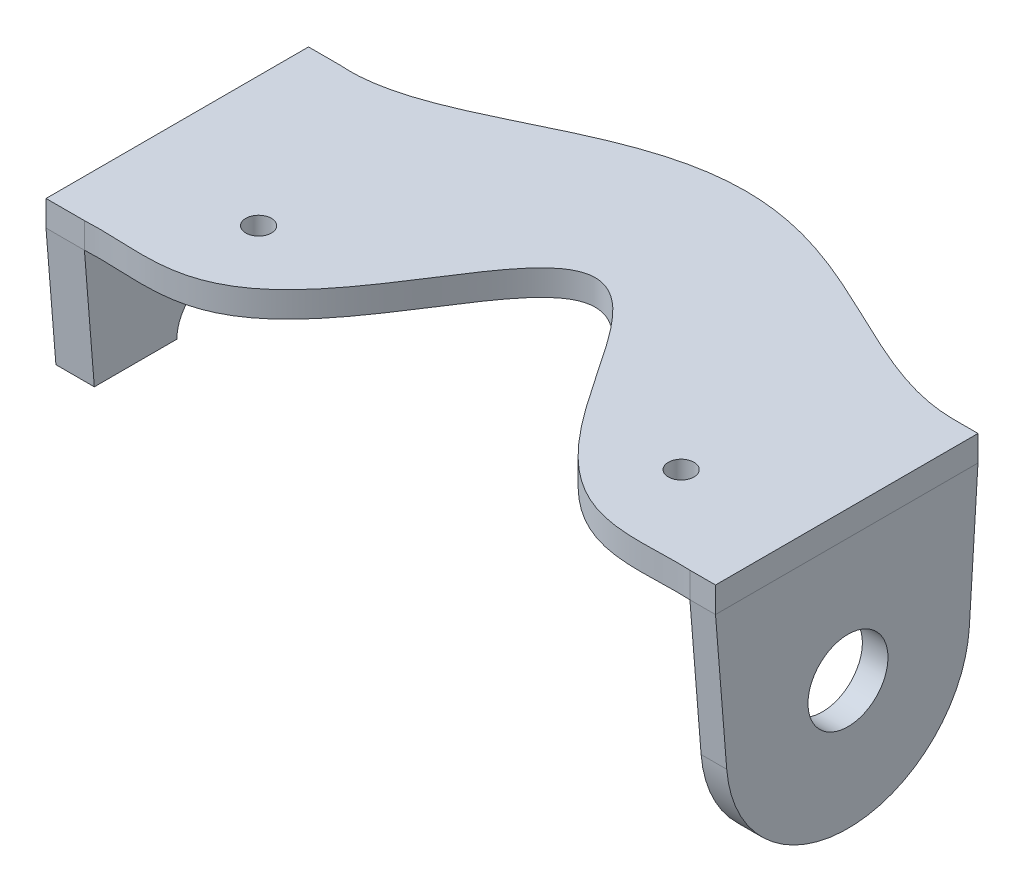
ISO-10303-21;
HEADER;
FILE_DESCRIPTION(('STEP AP214'),'2;1');
FILE_NAME('part.step','',(''),(''),'','','');
FILE_SCHEMA(('AUTOMOTIVE_DESIGN { 1 0 10303 214 1 1 1 1 }'));
ENDSEC;
DATA;
#1=APPLICATION_CONTEXT('core data for automotive mechanical design processes');
#2=APPLICATION_PROTOCOL_DEFINITION('international standard','automotive_design',2000,#1);
#3=PRODUCT_CONTEXT('',#1,'mechanical');
#4=PRODUCT('Part','Part','',(#3));
#5=PRODUCT_RELATED_PRODUCT_CATEGORY('part','',(#4));
#6=PRODUCT_DEFINITION_FORMATION('','',#4);
#7=PRODUCT_DEFINITION_CONTEXT('part definition',#1,'design');
#8=PRODUCT_DEFINITION('design','',#6,#7);
#9=PRODUCT_DEFINITION_SHAPE('','',#8);
#10=(LENGTH_UNIT() NAMED_UNIT(*) SI_UNIT(.MILLI.,.METRE.));
#11=(NAMED_UNIT(*) PLANE_ANGLE_UNIT() SI_UNIT($,.RADIAN.));
#12=(NAMED_UNIT(*) SI_UNIT($,.STERADIAN.) SOLID_ANGLE_UNIT());
#13=UNCERTAINTY_MEASURE_WITH_UNIT(LENGTH_MEASURE(1.E-05),#10,'distance_accuracy_value','');
#14=(GEOMETRIC_REPRESENTATION_CONTEXT(3) GLOBAL_UNCERTAINTY_ASSIGNED_CONTEXT((#13)) GLOBAL_UNIT_ASSIGNED_CONTEXT((#10,
#11,#12)) REPRESENTATION_CONTEXT('',''));
#15=CARTESIAN_POINT('',(0.,0.,0.));
#16=DIRECTION('',(0.,0.,1.));
#17=DIRECTION('',(1.,0.,0.));
#18=AXIS2_PLACEMENT_3D('',#15,#16,#17);
#19=CARTESIAN_POINT('',(0.0357860167297162,21.2689969603554,2.29301922996902));
#20=DIRECTION('',(0.,1.,0.));
#21=DIRECTION('',(0.,0.,-1.));
#22=AXIS2_PLACEMENT_3D('',#19,#20,#21);
#23=PLANE('',#22);
#24=CARTESIAN_POINT('',(-33.,21.2689969603556,21.5458460219843));
#25=DIRECTION('',(0.,1.,0.));
#26=DIRECTION('',(0.,0.,1.));
#27=AXIS2_PLACEMENT_3D('',#24,#25,#26);
#28=CIRCLE('',#27,2.00000000000001);
#29=CARTESIAN_POINT('',(-33.,21.2689969603556,23.5458460219843));
#30=VERTEX_POINT('',#29);
#31=EDGE_CURVE('P0_E188',#30,#30,#28,.T.);
#32=ORIENTED_EDGE('',*,*,#31,.T.);
#33=EDGE_LOOP('',(#32));
#34=FACE_BOUND('',#33,.T.);
#35=CARTESIAN_POINT('',(33.,21.2689969603555,21.5458460219843));
#36=DIRECTION('',(0.,1.,0.));
#37=DIRECTION('',(0.,0.,1.));
#38=AXIS2_PLACEMENT_3D('',#35,#36,#37);
#39=CIRCLE('',#38,2.);
#40=CARTESIAN_POINT('',(33.,21.2689969603556,23.5458460219843));
#41=VERTEX_POINT('',#40);
#42=EDGE_CURVE('P0_E233',#41,#41,#39,.T.);
#43=ORIENTED_EDGE('',*,*,#42,.T.);
#44=EDGE_LOOP('',(#43));
#45=FACE_BOUND('',#44,.T.);
#46=DIRECTION('',(0.,0.,1.));
#47=VECTOR('',#46,1.);
#48=CARTESIAN_POINT('',(-53.2837758577564,21.2689969603556,-6.53461129582813));
#49=LINE('',#48,#47);
#50=CARTESIAN_POINT('',(-53.2837758577564,21.2689969603556,-6.53461129582813));
#51=VERTEX_POINT('',#50);
#52=CARTESIAN_POINT('',(-53.2837758577564,21.2689969603556,34.4653887041719));
#53=VERTEX_POINT('',#52);
#54=EDGE_CURVE('P0_E182',#51,#53,#49,.T.);
#55=ORIENTED_EDGE('',*,*,#54,.F.);
#56=DIRECTION('',(-1.,0.,0.));
#57=VECTOR('',#56,1.);
#58=CARTESIAN_POINT('',(-48.2837758577565,21.2689969603556,-6.53461129582811));
#59=LINE('',#58,#57);
#60=CARTESIAN_POINT('',(-48.2837758577565,21.2689969603556,-6.53461129582813));
#61=VERTEX_POINT('',#60);
#62=EDGE_CURVE('P0_E58',#61,#51,#59,.T.);
#63=ORIENTED_EDGE('',*,*,#62,.F.);
#64=CARTESIAN_POINT('',(47.2888474952954,21.2689969603556,-6.53461129582813));
#65=CARTESIAN_POINT('',(22.2893497094017,21.2689969603556,-6.82632680724046));
#66=CARTESIAN_POINT('',(-0.735507918474241,21.2689969603556,-46.7031650132446));
#67=CARTESIAN_POINT('',(-23.0316048114772,21.2689969603556,-4.5792864379548));
#68=CARTESIAN_POINT('',(-48.2837758577565,21.2689969603556,-6.53461129582813));
#69=(BOUNDED_CURVE() B_SPLINE_CURVE(4,(#64,#65,#66,#67,#68),.UNSPECIFIED.,.F.,
.F.) B_SPLINE_CURVE_WITH_KNOTS((5,5),(0.,1.),
.UNSPECIFIED.) CURVE() GEOMETRIC_REPRESENTATION_ITEM() RATIONAL_B_SPLINE_CURVE((1.,1.,1.,1.,1.)) REPRESENTATION_ITEM(''));
#70=CARTESIAN_POINT('',(47.2888474952954,21.2689969603556,-6.53461129582813));
#71=VERTEX_POINT('',#70);
#72=EDGE_CURVE('P0_E103',#71,#61,#69,.T.);
#73=ORIENTED_EDGE('',*,*,#72,.F.);
#74=DIRECTION('',(-1.,0.,0.));
#75=VECTOR('',#74,1.);
#76=CARTESIAN_POINT('',(51.2888474952954,21.2689969603556,-6.53461129582813));
#77=LINE('',#76,#75);
#78=CARTESIAN_POINT('',(51.2888474952954,21.2689969603556,-6.53461129582813));
#79=VERTEX_POINT('',#78);
#80=EDGE_CURVE('P0_E197',#79,#71,#77,.T.);
#81=ORIENTED_EDGE('',*,*,#80,.F.);
#82=DIRECTION('',(0.,0.,-1.));
#83=VECTOR('',#82,1.);
#84=CARTESIAN_POINT('',(51.2888474952954,21.2689969603556,34.4653887041719));
#85=LINE('',#84,#83);
#86=CARTESIAN_POINT('',(51.2888474952954,21.2689969603556,34.4653887041719));
#87=VERTEX_POINT('',#86);
#88=EDGE_CURVE('P0_E143',#87,#79,#85,.T.);
#89=ORIENTED_EDGE('',*,*,#88,.F.);
#90=DIRECTION('',(1.,0.,0.));
#91=VECTOR('',#90,1.);
#92=CARTESIAN_POINT('',(47.2888474952954,21.2689969603556,34.4653887041719));
#93=LINE('',#92,#91);
#94=CARTESIAN_POINT('',(47.2888474952954,21.2689969603556,34.4653887041719));
#95=VERTEX_POINT('',#94);
#96=EDGE_CURVE('P0_E213',#95,#87,#93,.T.);
#97=ORIENTED_EDGE('',*,*,#96,.F.);
#98=CARTESIAN_POINT('',(-47.2837758577564,21.2689969603556,34.4653887041719));
#99=CARTESIAN_POINT('',(-35.7659756794948,21.2689969603556,33.7594323905051));
#100=CARTESIAN_POINT('',(-19.3052144255016,21.2689969603557,42.9273242584832));
#101=CARTESIAN_POINT('',(-0.477984318891941,21.2689969603551,-40.3925264297415));
#102=CARTESIAN_POINT('',(20.794089530906,21.2689969603557,41.4679138303698));
#103=CARTESIAN_POINT('',(35.8138139823402,21.2689969603556,33.926864755104));
#104=CARTESIAN_POINT('',(47.2888474952954,21.2689969603556,34.4653887041719));
#105=(BOUNDED_CURVE() B_SPLINE_CURVE(4,(#98,#99,#100,#101,#102,#103,#104),.UNSPECIFIED.,.F.,
.F.) B_SPLINE_CURVE_WITH_KNOTS((5,1,1,5),(0.,0.388004539781045,0.617610158258665,1.),
.UNSPECIFIED.) CURVE() GEOMETRIC_REPRESENTATION_ITEM() RATIONAL_B_SPLINE_CURVE((1.,1.,1.,1.,1.,
1.,1.)) REPRESENTATION_ITEM(''));
#106=CARTESIAN_POINT('',(-47.2837758577564,21.2689969603556,34.4653887041719));
#107=VERTEX_POINT('',#106);
#108=EDGE_CURVE('P0_E171',#107,#95,#105,.T.);
#109=ORIENTED_EDGE('',*,*,#108,.F.);
#110=DIRECTION('',(1.,0.,0.));
#111=VECTOR('',#110,1.);
#112=CARTESIAN_POINT('',(-53.2837758577564,21.2689969603556,34.4653887041719));
#113=LINE('',#112,#111);
#114=EDGE_CURVE('P0_E196',#53,#107,#113,.T.);
#115=ORIENTED_EDGE('',*,*,#114,.F.);
#116=EDGE_LOOP('',(#55,#63,#73,#81,#89,#97,#109,#115));
#117=FACE_BOUND('',#116,.T.);
#118=ADVANCED_FACE('P0_F47',(#34,#45,#117),#23,.F.);
#119=CARTESIAN_POINT('',(0.0357860167297162,25.2689969603554,2.29301922996902));
#120=DIRECTION('',(0.,1.,0.));
#121=DIRECTION('',(0.,0.,-1.));
#122=AXIS2_PLACEMENT_3D('',#119,#120,#121);
#123=PLANE('',#122);
#124=CARTESIAN_POINT('',(-33.,25.2689969603556,21.5458460219843));
#125=DIRECTION('',(0.,1.,0.));
#126=DIRECTION('',(0.,0.,1.));
#127=AXIS2_PLACEMENT_3D('',#124,#125,#126);
#128=CIRCLE('',#127,2.00000000000001);
#129=CARTESIAN_POINT('',(-33.,25.2689969603556,23.5458460219843));
#130=VERTEX_POINT('',#129);
#131=EDGE_CURVE('P0_E52',#130,#130,#128,.T.);
#132=ORIENTED_EDGE('',*,*,#131,.F.);
#133=EDGE_LOOP('',(#132));
#134=FACE_BOUND('',#133,.T.);
#135=CARTESIAN_POINT('',(33.,25.2689969603555,21.5458460219843));
#136=DIRECTION('',(0.,1.,0.));
#137=DIRECTION('',(0.,0.,1.));
#138=AXIS2_PLACEMENT_3D('',#135,#136,#137);
#139=CIRCLE('',#138,2.);
#140=CARTESIAN_POINT('',(33.,25.2689969603556,23.5458460219843));
#141=VERTEX_POINT('',#140);
#142=EDGE_CURVE('P0_E231',#141,#141,#139,.T.);
#143=ORIENTED_EDGE('',*,*,#142,.F.);
#144=EDGE_LOOP('',(#143));
#145=FACE_BOUND('',#144,.T.);
#146=DIRECTION('',(0.,0.,1.));
#147=VECTOR('',#146,1.);
#148=CARTESIAN_POINT('',(-53.2837758577564,25.2689969603556,-6.53461129582813));
#149=LINE('',#148,#147);
#150=CARTESIAN_POINT('',(-53.2837758577564,25.2689969603556,-6.53461129582813));
#151=VERTEX_POINT('',#150);
#152=CARTESIAN_POINT('',(-53.2837758577564,25.2689969603556,34.4653887041719));
#153=VERTEX_POINT('',#152);
#154=EDGE_CURVE('P0_E174',#151,#153,#149,.T.);
#155=ORIENTED_EDGE('',*,*,#154,.T.);
#156=DIRECTION('',(1.,0.,0.));
#157=VECTOR('',#156,1.);
#158=CARTESIAN_POINT('',(-53.2837758577564,25.2689969603556,34.4653887041719));
#159=LINE('',#158,#157);
#160=CARTESIAN_POINT('',(-47.2837758577564,25.2689969603556,34.4653887041719));
#161=VERTEX_POINT('',#160);
#162=EDGE_CURVE('P0_E160',#153,#161,#159,.T.);
#163=ORIENTED_EDGE('',*,*,#162,.T.);
#164=CARTESIAN_POINT('',(-47.2837758577564,25.2689969603556,34.4653887041719));
#165=CARTESIAN_POINT('',(-35.7659756794948,25.2689969603556,33.7594323905051));
#166=CARTESIAN_POINT('',(-19.3052144255016,25.2689969603557,42.9273242584832));
#167=CARTESIAN_POINT('',(-0.477984318891941,25.2689969603551,-40.3925264297415));
#168=CARTESIAN_POINT('',(20.794089530906,25.2689969603557,41.4679138303698));
#169=CARTESIAN_POINT('',(35.8138139823402,25.2689969603556,33.926864755104));
#170=CARTESIAN_POINT('',(47.2888474952954,25.2689969603556,34.4653887041719));
#171=(BOUNDED_CURVE() B_SPLINE_CURVE(4,(#164,#165,#166,#167,#168,#169,#170),.UNSPECIFIED.,.F.,
.F.) B_SPLINE_CURVE_WITH_KNOTS((5,1,1,5),(0.,0.388004539781045,0.617610158258665,1.),
.UNSPECIFIED.) CURVE() GEOMETRIC_REPRESENTATION_ITEM() RATIONAL_B_SPLINE_CURVE((1.,1.,1.,1.,1.,
1.,1.)) REPRESENTATION_ITEM(''));
#172=CARTESIAN_POINT('',(47.2888474952954,25.2689969603556,34.4653887041719));
#173=VERTEX_POINT('',#172);
#174=EDGE_CURVE('P0_E220',#161,#173,#171,.T.);
#175=ORIENTED_EDGE('',*,*,#174,.T.);
#176=DIRECTION('',(1.,0.,0.));
#177=VECTOR('',#176,1.);
#178=CARTESIAN_POINT('',(47.2888474952954,25.2689969603556,34.4653887041719));
#179=LINE('',#178,#177);
#180=CARTESIAN_POINT('',(51.2888474952954,25.2689969603556,34.4653887041719));
#181=VERTEX_POINT('',#180);
#182=EDGE_CURVE('P0_E152',#173,#181,#179,.T.);
#183=ORIENTED_EDGE('',*,*,#182,.T.);
#184=DIRECTION('',(0.,0.,-1.));
#185=VECTOR('',#184,1.);
#186=CARTESIAN_POINT('',(51.2888474952954,25.2689969603556,34.4653887041719));
#187=LINE('',#186,#185);
#188=CARTESIAN_POINT('',(51.2888474952954,25.2689969603556,-6.53461129582813));
#189=VERTEX_POINT('',#188);
#190=EDGE_CURVE('P0_E137',#181,#189,#187,.T.);
#191=ORIENTED_EDGE('',*,*,#190,.T.);
#192=DIRECTION('',(-1.,0.,0.));
#193=VECTOR('',#192,1.);
#194=CARTESIAN_POINT('',(51.2888474952954,25.2689969603556,-6.53461129582813));
#195=LINE('',#194,#193);
#196=CARTESIAN_POINT('',(47.2888474952954,25.2689969603556,-6.53461129582813));
#197=VERTEX_POINT('',#196);
#198=EDGE_CURVE('P0_E116',#189,#197,#195,.T.);
#199=ORIENTED_EDGE('',*,*,#198,.T.);
#200=CARTESIAN_POINT('',(47.2888474952954,25.2689969603556,-6.53461129582813));
#201=CARTESIAN_POINT('',(22.2893497094017,25.2689969603556,-6.82632680724046));
#202=CARTESIAN_POINT('',(-0.735507918474241,25.2689969603556,-46.7031650132446));
#203=CARTESIAN_POINT('',(-23.0316048114772,25.2689969603556,-4.5792864379548));
#204=CARTESIAN_POINT('',(-48.2837758577565,25.2689969603556,-6.53461129582813));
#205=(BOUNDED_CURVE() B_SPLINE_CURVE(4,(#200,#201,#202,#203,#204),.UNSPECIFIED.,.F.,
.F.) B_SPLINE_CURVE_WITH_KNOTS((5,5),(0.,1.),
.UNSPECIFIED.) CURVE() GEOMETRIC_REPRESENTATION_ITEM() RATIONAL_B_SPLINE_CURVE((1.,1.,1.,1.,1.)) REPRESENTATION_ITEM(''));
#206=CARTESIAN_POINT('',(-48.2837758577565,25.2689969603556,-6.53461129582813));
#207=VERTEX_POINT('',#206);
#208=EDGE_CURVE('P0_E207',#197,#207,#205,.T.);
#209=ORIENTED_EDGE('',*,*,#208,.T.);
#210=DIRECTION('',(-1.,0.,0.));
#211=VECTOR('',#210,1.);
#212=CARTESIAN_POINT('',(-48.2837758577565,25.2689969603556,-6.53461129582811));
#213=LINE('',#212,#211);
#214=EDGE_CURVE('P0_E11',#207,#151,#213,.T.);
#215=ORIENTED_EDGE('',*,*,#214,.T.);
#216=EDGE_LOOP('',(#155,#163,#175,#183,#191,#199,#209,#215));
#217=FACE_BOUND('',#216,.T.);
#218=ADVANCED_FACE('P0_F175',(#134,#145,#217),#123,.T.);
#219=CARTESIAN_POINT('',(-48.2837758577565,25.2689969603556,-6.53461129582811));
#220=DIRECTION('',(0.,0.,1.));
#221=DIRECTION('',(1.,0.,0.));
#222=AXIS2_PLACEMENT_3D('',#219,#220,#221);
#223=PLANE('',#222);
#224=ORIENTED_EDGE('',*,*,#62,.T.);
#225=DIRECTION('',(0.,-1.,0.));
#226=VECTOR('',#225,1.);
#227=CARTESIAN_POINT('',(-53.2837758577564,25.2689969603556,-6.53461129582813));
#228=LINE('',#227,#226);
#229=EDGE_CURVE('P0_E179',#151,#51,#228,.T.);
#230=ORIENTED_EDGE('',*,*,#229,.F.);
#231=ORIENTED_EDGE('',*,*,#214,.F.);
#232=DIRECTION('',(0.,-1.,0.));
#233=VECTOR('',#232,1.);
#234=CARTESIAN_POINT('',(-48.2837758577565,25.2689969603556,-6.53461129582813));
#235=LINE('',#234,#233);
#236=EDGE_CURVE('P0_E212',#207,#61,#235,.T.);
#237=ORIENTED_EDGE('',*,*,#236,.T.);
#238=EDGE_LOOP('',(#224,#230,#231,#237));
#239=FACE_BOUND('',#238,.T.);
#240=ADVANCED_FACE('P0_F270',(#239),#223,.F.);
#241=CARTESIAN_POINT('',(47.2888474952954,25.2689969603556,-6.53461129582813));
#242=CARTESIAN_POINT('',(22.2893497094017,25.2689969603556,-6.82632680724046));
#243=CARTESIAN_POINT('',(-0.735507918474241,25.2689969603556,-46.7031650132446));
#244=CARTESIAN_POINT('',(-23.0316048114772,25.2689969603556,-4.5792864379548));
#245=CARTESIAN_POINT('',(-48.2837758577565,25.2689969603556,-6.53461129582813));
#246=(BOUNDED_CURVE() B_SPLINE_CURVE(4,(#241,#242,#243,#244,#245),.UNSPECIFIED.,.F.,
.F.) B_SPLINE_CURVE_WITH_KNOTS((5,5),(0.,1.),
.UNSPECIFIED.) CURVE() GEOMETRIC_REPRESENTATION_ITEM() RATIONAL_B_SPLINE_CURVE((1.,1.,1.,1.,1.)) REPRESENTATION_ITEM(''));
#247=DIRECTION('',(0.,-1.,0.));
#248=VECTOR('',#247,1.);
#249=SURFACE_OF_LINEAR_EXTRUSION('',#246,#248);
#250=ORIENTED_EDGE('',*,*,#72,.T.);
#251=ORIENTED_EDGE('',*,*,#236,.F.);
#252=ORIENTED_EDGE('',*,*,#208,.F.);
#253=DIRECTION('',(0.,-1.,0.));
#254=VECTOR('',#253,1.);
#255=CARTESIAN_POINT('',(47.2888474952954,25.2689969603556,-6.53461129582813));
#256=LINE('',#255,#254);
#257=EDGE_CURVE('P0_E201',#197,#71,#256,.T.);
#258=ORIENTED_EDGE('',*,*,#257,.T.);
#259=EDGE_LOOP('',(#250,#251,#252,#258));
#260=FACE_BOUND('',#259,.T.);
#261=ADVANCED_FACE('P0_F49',(#260),#249,.F.);
#262=CARTESIAN_POINT('',(51.2888474952954,25.2689969603556,-6.53461129582813));
#263=DIRECTION('',(0.,0.,1.));
#264=DIRECTION('',(1.,0.,0.));
#265=AXIS2_PLACEMENT_3D('',#262,#263,#264);
#266=PLANE('',#265);
#267=ORIENTED_EDGE('',*,*,#80,.T.);
#268=ORIENTED_EDGE('',*,*,#257,.F.);
#269=ORIENTED_EDGE('',*,*,#198,.F.);
#270=DIRECTION('',(0.,-1.,0.));
#271=VECTOR('',#270,1.);
#272=CARTESIAN_POINT('',(51.2888474952954,25.2689969603556,-6.53461129582813));
#273=LINE('',#272,#271);
#274=EDGE_CURVE('P0_E204',#189,#79,#273,.T.);
#275=ORIENTED_EDGE('',*,*,#274,.T.);
#276=EDGE_LOOP('',(#267,#268,#269,#275));
#277=FACE_BOUND('',#276,.T.);
#278=ADVANCED_FACE('P0_F266',(#277),#266,.F.);
#279=CARTESIAN_POINT('',(51.2888474952954,25.2689969603556,34.4653887041719));
#280=DIRECTION('',(-1.,0.,0.));
#281=DIRECTION('',(0.,0.,1.));
#282=AXIS2_PLACEMENT_3D('',#279,#280,#281);
#283=PLANE('',#282);
#284=ORIENTED_EDGE('',*,*,#88,.T.);
#285=ORIENTED_EDGE('',*,*,#274,.F.);
#286=ORIENTED_EDGE('',*,*,#190,.F.);
#287=DIRECTION('',(0.,-1.,0.));
#288=VECTOR('',#287,1.);
#289=CARTESIAN_POINT('',(51.2888474952954,25.2689969603556,34.4653887041719));
#290=LINE('',#289,#288);
#291=EDGE_CURVE('P0_E192',#181,#87,#290,.T.);
#292=ORIENTED_EDGE('',*,*,#291,.T.);
#293=EDGE_LOOP('',(#284,#285,#286,#292));
#294=FACE_BOUND('',#293,.T.);
#295=ADVANCED_FACE('P0_F263',(#294),#283,.F.);
#296=CARTESIAN_POINT('',(47.2888474952954,25.2689969603556,34.4653887041719));
#297=DIRECTION('',(0.,0.,-1.));
#298=DIRECTION('',(0.,-1.,0.));
#299=AXIS2_PLACEMENT_3D('',#296,#297,#298);
#300=PLANE('',#299);
#301=ORIENTED_EDGE('',*,*,#96,.T.);
#302=ORIENTED_EDGE('',*,*,#291,.F.);
#303=ORIENTED_EDGE('',*,*,#182,.F.);
#304=DIRECTION('',(0.,-1.,0.));
#305=VECTOR('',#304,1.);
#306=CARTESIAN_POINT('',(47.2888474952954,25.2689969603556,34.4653887041719));
#307=LINE('',#306,#305);
#308=EDGE_CURVE('P0_E290',#173,#95,#307,.T.);
#309=ORIENTED_EDGE('',*,*,#308,.T.);
#310=EDGE_LOOP('',(#301,#302,#303,#309));
#311=FACE_BOUND('',#310,.T.);
#312=ADVANCED_FACE('P0_F258',(#311),#300,.F.);
#313=CARTESIAN_POINT('',(-47.2837758577564,25.2689969603556,34.4653887041719));
#314=CARTESIAN_POINT('',(-35.7659756794948,25.2689969603556,33.7594323905051));
#315=CARTESIAN_POINT('',(-19.3052144255016,25.2689969603557,42.9273242584832));
#316=CARTESIAN_POINT('',(-0.477984318891941,25.2689969603551,-40.3925264297415));
#317=CARTESIAN_POINT('',(20.794089530906,25.2689969603557,41.4679138303698));
#318=CARTESIAN_POINT('',(35.8138139823402,25.2689969603556,33.926864755104));
#319=CARTESIAN_POINT('',(47.2888474952954,25.2689969603556,34.4653887041719));
#320=(BOUNDED_CURVE() B_SPLINE_CURVE(4,(#313,#314,#315,#316,#317,#318,#319),.UNSPECIFIED.,.F.,
.F.) B_SPLINE_CURVE_WITH_KNOTS((5,1,1,5),(0.,0.388004539781045,0.617610158258665,1.),
.UNSPECIFIED.) CURVE() GEOMETRIC_REPRESENTATION_ITEM() RATIONAL_B_SPLINE_CURVE((1.,1.,1.,1.,1.,
1.,1.)) REPRESENTATION_ITEM(''));
#321=DIRECTION('',(0.,-1.,0.));
#322=VECTOR('',#321,1.);
#323=SURFACE_OF_LINEAR_EXTRUSION('',#320,#322);
#324=ORIENTED_EDGE('',*,*,#108,.T.);
#325=ORIENTED_EDGE('',*,*,#308,.F.);
#326=ORIENTED_EDGE('',*,*,#174,.F.);
#327=DIRECTION('',(0.,-1.,0.));
#328=VECTOR('',#327,1.);
#329=CARTESIAN_POINT('',(-47.2837758577564,25.2689969603556,34.4653887041719));
#330=LINE('',#329,#328);
#331=EDGE_CURVE('P0_E168',#161,#107,#330,.T.);
#332=ORIENTED_EDGE('',*,*,#331,.T.);
#333=EDGE_LOOP('',(#324,#325,#326,#332));
#334=FACE_BOUND('',#333,.T.);
#335=ADVANCED_FACE('P0_F254',(#334),#323,.F.);
#336=CARTESIAN_POINT('',(-53.2837758577564,25.2689969603556,34.4653887041719));
#337=DIRECTION('',(0.,0.,-1.));
#338=DIRECTION('',(0.,-1.,0.));
#339=AXIS2_PLACEMENT_3D('',#336,#337,#338);
#340=PLANE('',#339);
#341=ORIENTED_EDGE('',*,*,#114,.T.);
#342=ORIENTED_EDGE('',*,*,#331,.F.);
#343=ORIENTED_EDGE('',*,*,#162,.F.);
#344=DIRECTION('',(0.,-1.,0.));
#345=VECTOR('',#344,1.);
#346=CARTESIAN_POINT('',(-53.2837758577564,25.2689969603556,34.4653887041719));
#347=LINE('',#346,#345);
#348=EDGE_CURVE('P0_E165',#153,#53,#347,.T.);
#349=ORIENTED_EDGE('',*,*,#348,.T.);
#350=EDGE_LOOP('',(#341,#342,#343,#349));
#351=FACE_BOUND('',#350,.T.);
#352=ADVANCED_FACE('P0_F163',(#351),#340,.F.);
#353=CARTESIAN_POINT('',(-53.2837758577564,25.2689969603556,-6.53461129582813));
#354=DIRECTION('',(1.,0.,0.));
#355=DIRECTION('',(0.,1.,0.));
#356=AXIS2_PLACEMENT_3D('',#353,#354,#355);
#357=PLANE('',#356);
#358=ORIENTED_EDGE('',*,*,#54,.T.);
#359=ORIENTED_EDGE('',*,*,#348,.F.);
#360=ORIENTED_EDGE('',*,*,#154,.F.);
#361=ORIENTED_EDGE('',*,*,#229,.T.);
#362=EDGE_LOOP('',(#358,#359,#360,#361));
#363=FACE_BOUND('',#362,.T.);
#364=ADVANCED_FACE('P0_F181',(#363),#357,.F.);
#365=CARTESIAN_POINT('',(33.,26.2689969603555,21.5458460219843));
#366=DIRECTION('',(0.,-1.,0.));
#367=DIRECTION('',(0.,0.,-1.));
#368=AXIS2_PLACEMENT_3D('',#365,#366,#367);
#369=CYLINDRICAL_SURFACE('',#368,2.);
#370=ORIENTED_EDGE('',*,*,#142,.T.);
#371=EDGE_LOOP('',(#370));
#372=FACE_BOUND('',#371,.T.);
#373=ORIENTED_EDGE('',*,*,#42,.F.);
#374=EDGE_LOOP('',(#373));
#375=FACE_BOUND('',#374,.T.);
#376=ADVANCED_FACE('P0_F274',(#372,#375),#369,.F.);
#377=CARTESIAN_POINT('',(-33.,26.2689969603556,21.5458460219843));
#378=DIRECTION('',(0.,-1.,0.));
#379=DIRECTION('',(0.,0.,-1.));
#380=AXIS2_PLACEMENT_3D('',#377,#378,#379);
#381=CYLINDRICAL_SURFACE('',#380,2.00000000000001);
#382=ORIENTED_EDGE('',*,*,#131,.T.);
#383=EDGE_LOOP('',(#382));
#384=FACE_BOUND('',#383,.T.);
#385=ORIENTED_EDGE('',*,*,#31,.F.);
#386=EDGE_LOOP('',(#385));
#387=FACE_BOUND('',#386,.T.);
#388=ADVANCED_FACE('P0_F449',(#384,#387),#381,.F.);
#389=CLOSED_SHELL('',(#118,#218,#240,#261,#278,#295,#312,#335,#352,#364,#376,#388));
#390=MANIFOLD_SOLID_BREP('P0_B2',#389);
#391=CARTESIAN_POINT('',(-50.2167505626835,98.004360285949,29.7356807783174));
#392=DIRECTION('',(0.,-1.,0.));
#393=DIRECTION('',(0.,0.,-1.));
#394=AXIS2_PLACEMENT_3D('',#391,#392,#393);
#395=CYLINDRICAL_SURFACE('',#394,1.6);
#396=CARTESIAN_POINT('',(-50.2167505626835,2.00436028693725,29.7356807783174));
#397=DIRECTION('',(0.,1.,1.36799209113359E-11));
#398=DIRECTION('',(0.,1.36799209113359E-11,-1.));
#399=AXIS2_PLACEMENT_3D('',#396,#397,#398);
#400=CIRCLE('',#399,1.6);
#401=CARTESIAN_POINT('',(-50.2167505626835,2.00436028695914,28.1356807783174));
#402=VERTEX_POINT('',#401);
#403=EDGE_CURVE('P1_E167',#402,#402,#400,.T.);
#404=ORIENTED_EDGE('',*,*,#403,.F.);
#405=EDGE_LOOP('',(#404));
#406=FACE_BOUND('',#405,.T.);
#407=CARTESIAN_POINT('',(-50.2167505626835,10.0043602869373,29.7356807783174));
#408=DIRECTION('',(0.,-1.,-1.36793788102496E-11));
#409=DIRECTION('',(0.,1.36793788102496E-11,-1.));
#410=AXIS2_PLACEMENT_3D('',#407,#408,#409);
#411=CIRCLE('',#410,1.6);
#412=CARTESIAN_POINT('',(-50.2167505626835,10.0043602869591,28.1356807783174));
#413=VERTEX_POINT('',#412);
#414=EDGE_CURVE('P1_E11',#413,#413,#411,.T.);
#415=ORIENTED_EDGE('',*,*,#414,.F.);
#416=EDGE_LOOP('',(#415));
#417=FACE_BOUND('',#416,.T.);
#418=ADVANCED_FACE('P1_F17',(#406,#417),#395,.F.);
#419=CARTESIAN_POINT('',(-53.2888474952954,10.0043602873111,2.40448577492743));
#420=DIRECTION('',(0.,-1.,-1.36798526551311E-11));
#421=DIRECTION('',(0.,1.36798526551311E-11,-1.));
#422=AXIS2_PLACEMENT_3D('',#419,#420,#421);
#423=PLANE('',#422);
#424=ORIENTED_EDGE('',*,*,#414,.T.);
#425=EDGE_LOOP('',(#424));
#426=FACE_BOUND('',#425,.T.);
#427=ADVANCED_FACE('P1_F260',(#426),#423,.T.);
#428=CARTESIAN_POINT('',(-50.2167505626835,98.004360285949,-2.137870960902));
#429=DIRECTION('',(0.,-1.,0.));
#430=DIRECTION('',(0.,0.,-1.));
#431=AXIS2_PLACEMENT_3D('',#428,#429,#430);
#432=CYLINDRICAL_SURFACE('',#431,1.6);
#433=CARTESIAN_POINT('',(-50.2167505626835,2.00436028737327,-2.137870960902));
#434=DIRECTION('',(0.,1.,1.36799209113359E-11));
#435=DIRECTION('',(0.,1.36799209113359E-11,-1.));
#436=AXIS2_PLACEMENT_3D('',#433,#434,#435);
#437=CIRCLE('',#436,1.6);
#438=CARTESIAN_POINT('',(-50.2167505626835,2.00436028739516,-3.737870960902));
#439=VERTEX_POINT('',#438);
#440=EDGE_CURVE('P1_E126',#439,#439,#437,.T.);
#441=ORIENTED_EDGE('',*,*,#440,.F.);
#442=EDGE_LOOP('',(#441));
#443=FACE_BOUND('',#442,.T.);
#444=CARTESIAN_POINT('',(-50.2167505626835,10.0043602873733,-2.137870960902));
#445=DIRECTION('',(0.,-1.,-1.36793788102496E-11));
#446=DIRECTION('',(0.,1.36793788102496E-11,-1.));
#447=AXIS2_PLACEMENT_3D('',#444,#445,#446);
#448=CIRCLE('',#447,1.6);
#449=CARTESIAN_POINT('',(-50.2167505626835,10.0043602873952,-3.737870960902));
#450=VERTEX_POINT('',#449);
#451=EDGE_CURVE('P1_E27',#450,#450,#448,.T.);
#452=ORIENTED_EDGE('',*,*,#451,.F.);
#453=EDGE_LOOP('',(#452));
#454=FACE_BOUND('',#453,.T.);
#455=ADVANCED_FACE('P1_F266',(#443,#454),#432,.F.);
#456=CARTESIAN_POINT('',(-53.2888474952954,10.0043602873111,2.40448577492743));
#457=DIRECTION('',(0.,-1.,-1.36798526551311E-11));
#458=DIRECTION('',(0.,1.36798526551311E-11,-1.));
#459=AXIS2_PLACEMENT_3D('',#456,#457,#458);
#460=PLANE('',#459);
#461=ORIENTED_EDGE('',*,*,#451,.T.);
#462=EDGE_LOOP('',(#461));
#463=FACE_BOUND('',#462,.T.);
#464=ADVANCED_FACE('P1_F279',(#463),#460,.T.);
#465=CARTESIAN_POINT('',(-47.2888474952954,2.00436028741697,13.7751056113183));
#466=DIRECTION('',(-1.,0.,0.));
#467=DIRECTION('',(0.,0.,1.));
#468=AXIS2_PLACEMENT_3D('',#465,#466,#467);
#469=PLANE('',#468);
#470=DIRECTION('',(0.,-0.996791949121843,-0.0800363052987642));
#471=VECTOR('',#470,1.);
#472=CARTESIAN_POINT('',(-47.2888474952954,21.2689969603556,34.4653887041719));
#473=LINE('',#472,#471);
#474=CARTESIAN_POINT('',(-47.2888474952954,21.2689969603556,34.4653887041719));
#475=VERTEX_POINT('',#474);
#476=CARTESIAN_POINT('',(-47.2888474952954,2.00436028741704,32.9185560440732));
#477=VERTEX_POINT('',#476);
#478=EDGE_CURVE('P1_E148',#475,#477,#473,.T.);
#479=ORIENTED_EDGE('',*,*,#478,.T.);
#480=DIRECTION('',(0.,1.10453033589847E-10,-1.));
#481=VECTOR('',#480,1.);
#482=CARTESIAN_POINT('',(-47.2888474952954,2.004360287417,22.5457254478187));
#483=LINE('',#482,#481);
#484=CARTESIAN_POINT('',(-47.2888474952954,2.00436028769541,20.0251056113183));
#485=VERTEX_POINT('',#484);
#486=EDGE_CURVE('P1_E169',#477,#485,#483,.T.);
#487=ORIENTED_EDGE('',*,*,#486,.T.);
#488=CARTESIAN_POINT('',(-47.2888474952954,2.00436028741697,13.7751056113183));
#489=DIRECTION('',(-1.,0.,0.));
#490=DIRECTION('',(0.,1.,0.));
#491=AXIS2_PLACEMENT_3D('',#488,#489,#490);
#492=CIRCLE('',#491,6.25);
#493=CARTESIAN_POINT('',(-47.2888474952954,2.00436028725386,7.52510561131834));
#494=VERTEX_POINT('',#493);
#495=EDGE_CURVE('P1_E124',#485,#494,#492,.T.);
#496=ORIENTED_EDGE('',*,*,#495,.T.);
#497=DIRECTION('',(0.,1.36798526551311E-11,-1.));
#498=VECTOR('',#497,1.);
#499=CARTESIAN_POINT('',(-47.2888474952954,2.00436028731113,2.40448577481799));
#500=LINE('',#499,#498);
#501=CARTESIAN_POINT('',(-47.2888474952954,2.00436028741689,-5.32649791497086));
#502=VERTEX_POINT('',#501);
#503=EDGE_CURVE('P1_E116',#494,#502,#500,.T.);
#504=ORIENTED_EDGE('',*,*,#503,.T.);
#505=DIRECTION('',(0.,0.998039417688578,-0.0625885032561394));
#506=VECTOR('',#505,1.);
#507=CARTESIAN_POINT('',(-47.2888474952954,2.00436028741689,-5.32649791497086));
#508=LINE('',#507,#506);
#509=CARTESIAN_POINT('',(-47.2888474952954,21.2689969603555,-6.53461129582812));
#510=VERTEX_POINT('',#509);
#511=EDGE_CURVE('P1_E99',#502,#510,#508,.T.);
#512=ORIENTED_EDGE('',*,*,#511,.T.);
#513=DIRECTION('',(0.,0.,1.));
#514=VECTOR('',#513,1.);
#515=CARTESIAN_POINT('',(-47.2888474952954,21.2689969603556,13.5215117571514));
#516=LINE('',#515,#514);
#517=EDGE_CURVE('P1_E175',#510,#475,#516,.T.);
#518=ORIENTED_EDGE('',*,*,#517,.T.);
#519=EDGE_LOOP('',(#479,#487,#496,#504,#512,#518));
#520=FACE_BOUND('',#519,.T.);
#521=ADVANCED_FACE('P1_F122',(#520),#469,.F.);
#522=CARTESIAN_POINT('',(-53.2888474952954,2.00436028741697,13.7751056113183));
#523=DIRECTION('',(-1.,0.,0.));
#524=DIRECTION('',(0.,0.,1.));
#525=AXIS2_PLACEMENT_3D('',#522,#523,#524);
#526=PLANE('',#525);
#527=DIRECTION('',(0.,0.,-1.));
#528=VECTOR('',#527,1.);
#529=CARTESIAN_POINT('',(-53.2888474952954,2.00436028741704,32.9185560440732));
#530=LINE('',#529,#528);
#531=CARTESIAN_POINT('',(-53.2888474952954,2.00436028741704,32.9185560440732));
#532=VERTEX_POINT('',#531);
#533=CARTESIAN_POINT('',(-53.2888474952954,2.00436028769541,20.0251056113183));
#534=VERTEX_POINT('',#533);
#535=EDGE_CURVE('P1_E161',#532,#534,#530,.T.);
#536=ORIENTED_EDGE('',*,*,#535,.F.);
#537=DIRECTION('',(0.,-0.996791949121843,-0.0800363052987642));
#538=VECTOR('',#537,1.);
#539=CARTESIAN_POINT('',(-53.2888474952954,21.2689969603556,34.4653887041719));
#540=LINE('',#539,#538);
#541=CARTESIAN_POINT('',(-53.2888474952954,21.2689969603556,34.4653887041719));
#542=VERTEX_POINT('',#541);
#543=EDGE_CURVE('P1_E144',#542,#532,#540,.T.);
#544=ORIENTED_EDGE('',*,*,#543,.F.);
#545=DIRECTION('',(0.,0.,1.));
#546=VECTOR('',#545,1.);
#547=CARTESIAN_POINT('',(-53.2888474952954,21.2689969603555,-6.53461129582812));
#548=LINE('',#547,#546);
#549=CARTESIAN_POINT('',(-53.2888474952954,21.2689969603555,-6.53461129582812));
#550=VERTEX_POINT('',#549);
#551=EDGE_CURVE('P1_E21',#550,#542,#548,.T.);
#552=ORIENTED_EDGE('',*,*,#551,.F.);
#553=DIRECTION('',(0.,0.998039417688578,-0.0625885032561394));
#554=VECTOR('',#553,1.);
#555=CARTESIAN_POINT('',(-53.2888474952954,2.00436028741689,-5.32649791497086));
#556=LINE('',#555,#554);
#557=CARTESIAN_POINT('',(-53.2888474952954,2.00436028741689,-5.32649791497086));
#558=VERTEX_POINT('',#557);
#559=EDGE_CURVE('P1_E111',#558,#550,#556,.T.);
#560=ORIENTED_EDGE('',*,*,#559,.F.);
#561=DIRECTION('',(0.,5.43681430631608E-11,-1.));
#562=VECTOR('',#561,1.);
#563=CARTESIAN_POINT('',(-53.2888474952954,2.00436028713853,7.52510561131834));
#564=LINE('',#563,#562);
#565=CARTESIAN_POINT('',(-53.2888474952954,2.00436028725386,7.52510561131834));
#566=VERTEX_POINT('',#565);
#567=EDGE_CURVE('P1_E118',#566,#558,#564,.T.);
#568=ORIENTED_EDGE('',*,*,#567,.F.);
#569=CARTESIAN_POINT('',(-53.2888474952954,2.00436028741697,13.7751056113183));
#570=DIRECTION('',(-1.,0.,0.));
#571=DIRECTION('',(0.,1.,0.));
#572=AXIS2_PLACEMENT_3D('',#569,#570,#571);
#573=CIRCLE('',#572,6.25);
#574=EDGE_CURVE('P1_E140',#534,#566,#573,.T.);
#575=ORIENTED_EDGE('',*,*,#574,.F.);
#576=EDGE_LOOP('',(#536,#544,#552,#560,#568,#575));
#577=FACE_BOUND('',#576,.T.);
#578=ADVANCED_FACE('P1_F195',(#577),#526,.T.);
#579=CARTESIAN_POINT('',(-53.2888474952954,21.2689969603556,34.4653887041719));
#580=DIRECTION('',(0.,-0.0800363052987642,0.996791949121843));
#581=DIRECTION('',(-1.,0.,0.));
#582=AXIS2_PLACEMENT_3D('',#579,#580,#581);
#583=PLANE('',#582);
#584=ORIENTED_EDGE('',*,*,#478,.F.);
#585=DIRECTION('',(1.,0.,0.));
#586=VECTOR('',#585,1.);
#587=CARTESIAN_POINT('',(-53.2888474952954,21.2689969603556,34.4653887041719));
#588=LINE('',#587,#586);
#589=EDGE_CURVE('P1_E157',#542,#475,#588,.T.);
#590=ORIENTED_EDGE('',*,*,#589,.F.);
#591=ORIENTED_EDGE('',*,*,#543,.T.);
#592=DIRECTION('',(1.,0.,0.));
#593=VECTOR('',#592,1.);
#594=CARTESIAN_POINT('',(-53.2888474952954,2.00436028741704,32.9185560440732));
#595=LINE('',#594,#593);
#596=EDGE_CURVE('P1_E166',#532,#477,#595,.T.);
#597=ORIENTED_EDGE('',*,*,#596,.T.);
#598=EDGE_LOOP('',(#584,#590,#591,#597));
#599=FACE_BOUND('',#598,.T.);
#600=ADVANCED_FACE('P1_F198',(#599),#583,.T.);
#601=CARTESIAN_POINT('',(-53.2888474952954,21.2689969603556,13.5215117571514));
#602=DIRECTION('',(0.,1.,0.));
#603=DIRECTION('',(0.,0.,-1.));
#604=AXIS2_PLACEMENT_3D('',#601,#602,#603);
#605=PLANE('',#604);
#606=ORIENTED_EDGE('',*,*,#517,.F.);
#607=DIRECTION('',(1.,0.,0.));
#608=VECTOR('',#607,1.);
#609=CARTESIAN_POINT('',(-53.2888474952954,21.2689969603555,-6.53461129582812));
#610=LINE('',#609,#608);
#611=EDGE_CURVE('P1_E106',#550,#510,#610,.T.);
#612=ORIENTED_EDGE('',*,*,#611,.F.);
#613=ORIENTED_EDGE('',*,*,#551,.T.);
#614=ORIENTED_EDGE('',*,*,#589,.T.);
#615=EDGE_LOOP('',(#606,#612,#613,#614));
#616=FACE_BOUND('',#615,.T.);
#617=ADVANCED_FACE('P1_F193',(#616),#605,.T.);
#618=CARTESIAN_POINT('',(-53.2888474952954,2.00436028741689,-5.32649791497086));
#619=DIRECTION('',(0.,-0.0625885032561394,-0.998039417688578));
#620=DIRECTION('',(0.,-0.998039417688578,0.0625885032561394));
#621=AXIS2_PLACEMENT_3D('',#618,#619,#620);
#622=PLANE('',#621);
#623=ORIENTED_EDGE('',*,*,#511,.F.);
#624=DIRECTION('',(1.,0.,0.));
#625=VECTOR('',#624,1.);
#626=CARTESIAN_POINT('',(-53.2888474952954,2.00436028741689,-5.32649791497086));
#627=LINE('',#626,#625);
#628=EDGE_CURVE('P1_E103',#558,#502,#627,.T.);
#629=ORIENTED_EDGE('',*,*,#628,.F.);
#630=ORIENTED_EDGE('',*,*,#559,.T.);
#631=ORIENTED_EDGE('',*,*,#611,.T.);
#632=EDGE_LOOP('',(#623,#629,#630,#631));
#633=FACE_BOUND('',#632,.T.);
#634=ADVANCED_FACE('P1_F101',(#633),#622,.T.);
#635=CARTESIAN_POINT('',(-53.2888474952954,2.00436028731113,2.40448577481799));
#636=DIRECTION('',(0.,-1.,-1.36798526551311E-11));
#637=DIRECTION('',(0.,1.36798526551311E-11,-1.));
#638=AXIS2_PLACEMENT_3D('',#635,#636,#637);
#639=PLANE('',#638);
#640=ORIENTED_EDGE('',*,*,#503,.F.);
#641=DIRECTION('',(1.,0.,0.));
#642=VECTOR('',#641,1.);
#643=CARTESIAN_POINT('',(-53.2888474952954,2.00436028725386,7.52510561131834));
#644=LINE('',#643,#642);
#645=EDGE_CURVE('P1_E134',#566,#494,#644,.T.);
#646=ORIENTED_EDGE('',*,*,#645,.F.);
#647=ORIENTED_EDGE('',*,*,#567,.T.);
#648=ORIENTED_EDGE('',*,*,#628,.T.);
#649=EDGE_LOOP('',(#640,#646,#647,#648));
#650=FACE_BOUND('',#649,.T.);
#651=ORIENTED_EDGE('',*,*,#440,.T.);
#652=EDGE_LOOP('',(#651));
#653=FACE_BOUND('',#652,.T.);
#654=ADVANCED_FACE('P1_F19',(#650,#653),#639,.T.);
#655=CARTESIAN_POINT('',(-53.2888474952954,2.00436028741697,13.7751056113183));
#656=DIRECTION('',(1.,0.,0.));
#657=DIRECTION('',(0.,0.,-1.));
#658=AXIS2_PLACEMENT_3D('',#655,#656,#657);
#659=CYLINDRICAL_SURFACE('',#658,6.25);
#660=ORIENTED_EDGE('',*,*,#495,.F.);
#661=DIRECTION('',(1.,0.,0.));
#662=VECTOR('',#661,1.);
#663=CARTESIAN_POINT('',(-53.2888474952954,2.00436028769541,20.0251056113183));
#664=LINE('',#663,#662);
#665=EDGE_CURVE('P1_E165',#534,#485,#664,.T.);
#666=ORIENTED_EDGE('',*,*,#665,.F.);
#667=ORIENTED_EDGE('',*,*,#574,.T.);
#668=ORIENTED_EDGE('',*,*,#645,.T.);
#669=EDGE_LOOP('',(#660,#666,#667,#668));
#670=FACE_BOUND('',#669,.T.);
#671=ADVANCED_FACE('P1_F330',(#670),#659,.F.);
#672=CARTESIAN_POINT('',(-53.2888474952954,2.004360287417,22.5457254478187));
#673=DIRECTION('',(0.,-1.,-1.10453033589847E-10));
#674=DIRECTION('',(0.,1.10453033589847E-10,-1.));
#675=AXIS2_PLACEMENT_3D('',#672,#673,#674);
#676=PLANE('',#675);
#677=ORIENTED_EDGE('',*,*,#486,.F.);
#678=ORIENTED_EDGE('',*,*,#596,.F.);
#679=ORIENTED_EDGE('',*,*,#535,.T.);
#680=ORIENTED_EDGE('',*,*,#665,.T.);
#681=EDGE_LOOP('',(#677,#678,#679,#680));
#682=FACE_BOUND('',#681,.T.);
#683=ORIENTED_EDGE('',*,*,#403,.T.);
#684=EDGE_LOOP('',(#683));
#685=FACE_BOUND('',#684,.T.);
#686=ADVANCED_FACE('P1_F325',(#682,#685),#676,.T.);
#687=CLOSED_SHELL('',(#418,#427,#455,#464,#521,#578,#600,#617,#634,#654,#671,#686));
#688=MANIFOLD_SOLID_BREP('P1_B1',#687);
#689=CARTESIAN_POINT('',(47.2888474952954,0.979359577091098,13.7751056113183));
#690=DIRECTION('',(-1.,0.,0.));
#691=DIRECTION('',(0.,0.,1.));
#692=AXIS2_PLACEMENT_3D('',#689,#690,#691);
#693=PLANE('',#692);
#694=CARTESIAN_POINT('',(47.2888474952954,2.00436028741697,13.7751056113183));
#695=DIRECTION('',(-1.,0.,0.));
#696=DIRECTION('',(0.,1.,0.));
#697=AXIS2_PLACEMENT_3D('',#694,#695,#696);
#698=CIRCLE('',#697,6.25);
#699=CARTESIAN_POINT('',(47.2888474952954,8.25436028741697,13.7751056113183));
#700=VERTEX_POINT('',#699);
#701=EDGE_CURVE('P2_E11',#700,#700,#698,.T.);
#702=ORIENTED_EDGE('',*,*,#701,.F.);
#703=EDGE_LOOP('',(#702));
#704=FACE_BOUND('',#703,.T.);
#705=DIRECTION('',(0.,-0.998039417688578,0.0625885032561394));
#706=VECTOR('',#705,1.);
#707=CARTESIAN_POINT('',(47.2888474952954,21.2689969603555,-6.53461129582812));
#708=LINE('',#707,#706);
#709=CARTESIAN_POINT('',(47.2888474952954,21.2689969603555,-6.53461129582812));
#710=VERTEX_POINT('',#709);
#711=CARTESIAN_POINT('',(47.2888474952954,-0.209821984775555,-5.18764332476464));
#712=VERTEX_POINT('',#711);
#713=EDGE_CURVE('P2_E116',#710,#712,#708,.T.);
#714=ORIENTED_EDGE('',*,*,#713,.T.);
#715=CARTESIAN_POINT('',(47.2888474952954,0.979359577091098,13.7751056113183));
#716=DIRECTION('',(-1.,0.,0.));
#717=DIRECTION('',(0.,1.,0.));
#718=AXIS2_PLACEMENT_3D('',#715,#716,#717);
#719=CIRCLE('',#718,19.);
#720=CARTESIAN_POINT('',(47.2888474952954,-0.541330223585426,32.7141526446334));
#721=VERTEX_POINT('',#720);
#722=EDGE_CURVE('P2_E104',#712,#721,#719,.T.);
#723=ORIENTED_EDGE('',*,*,#722,.T.);
#724=DIRECTION('',(0.,0.996791949121843,0.0800363052987643));
#725=VECTOR('',#724,1.);
#726=CARTESIAN_POINT('',(47.2888474952954,-0.541330223585423,32.7141526446334));
#727=LINE('',#726,#725);
#728=CARTESIAN_POINT('',(47.2888474952954,21.2689969603556,34.4653887041719));
#729=VERTEX_POINT('',#728);
#730=EDGE_CURVE('P2_E89',#721,#729,#727,.T.);
#731=ORIENTED_EDGE('',*,*,#730,.T.);
#732=DIRECTION('',(0.,0.,-1.));
#733=VECTOR('',#732,1.);
#734=CARTESIAN_POINT('',(47.2888474952954,21.2689969603556,13.5215117571514));
#735=LINE('',#734,#733);
#736=EDGE_CURVE('P2_E67',#729,#710,#735,.T.);
#737=ORIENTED_EDGE('',*,*,#736,.T.);
#738=EDGE_LOOP('',(#714,#723,#731,#737));
#739=FACE_BOUND('',#738,.T.);
#740=ADVANCED_FACE('P2_F17',(#704,#739),#693,.T.);
#741=CARTESIAN_POINT('',(51.2888474952954,0.979359577091098,13.7751056113183));
#742=DIRECTION('',(-1.,0.,0.));
#743=DIRECTION('',(0.,0.,1.));
#744=AXIS2_PLACEMENT_3D('',#741,#742,#743);
#745=PLANE('',#744);
#746=CARTESIAN_POINT('',(51.2888474952954,2.00436028741697,13.7751056113183));
#747=DIRECTION('',(-1.,0.,0.));
#748=DIRECTION('',(0.,1.,0.));
#749=AXIS2_PLACEMENT_3D('',#746,#747,#748);
#750=CIRCLE('',#749,6.25);
#751=CARTESIAN_POINT('',(51.2888474952954,8.25436028741697,13.7751056113183));
#752=VERTEX_POINT('',#751);
#753=EDGE_CURVE('P2_E28',#752,#752,#750,.T.);
#754=ORIENTED_EDGE('',*,*,#753,.T.);
#755=EDGE_LOOP('',(#754));
#756=FACE_BOUND('',#755,.T.);
#757=DIRECTION('',(0.,-0.998039417688578,0.0625885032561394));
#758=VECTOR('',#757,1.);
#759=CARTESIAN_POINT('',(51.2888474952954,21.2689969603555,-6.53461129582812));
#760=LINE('',#759,#758);
#761=CARTESIAN_POINT('',(51.2888474952954,21.2689969603555,-6.53461129582812));
#762=VERTEX_POINT('',#761);
#763=CARTESIAN_POINT('',(51.2888474952954,-0.209821984775555,-5.18764332476464));
#764=VERTEX_POINT('',#763);
#765=EDGE_CURVE('P2_E21',#762,#764,#760,.T.);
#766=ORIENTED_EDGE('',*,*,#765,.F.);
#767=DIRECTION('',(0.,0.,-1.));
#768=VECTOR('',#767,1.);
#769=CARTESIAN_POINT('',(51.2888474952954,21.2689969603556,34.4653887041719));
#770=LINE('',#769,#768);
#771=CARTESIAN_POINT('',(51.2888474952954,21.2689969603556,34.4653887041719));
#772=VERTEX_POINT('',#771);
#773=EDGE_CURVE('P2_E85',#772,#762,#770,.T.);
#774=ORIENTED_EDGE('',*,*,#773,.F.);
#775=DIRECTION('',(0.,0.996791949121843,0.0800363052987643));
#776=VECTOR('',#775,1.);
#777=CARTESIAN_POINT('',(51.2888474952954,-0.541330223585423,32.7141526446334));
#778=LINE('',#777,#776);
#779=CARTESIAN_POINT('',(51.2888474952954,-0.541330223585426,32.7141526446334));
#780=VERTEX_POINT('',#779);
#781=EDGE_CURVE('P2_E78',#780,#772,#778,.T.);
#782=ORIENTED_EDGE('',*,*,#781,.F.);
#783=CARTESIAN_POINT('',(51.2888474952954,0.979359577091098,13.7751056113183));
#784=DIRECTION('',(-1.,0.,0.));
#785=DIRECTION('',(0.,1.,0.));
#786=AXIS2_PLACEMENT_3D('',#783,#784,#785);
#787=CIRCLE('',#786,19.);
#788=EDGE_CURVE('P2_E83',#764,#780,#787,.T.);
#789=ORIENTED_EDGE('',*,*,#788,.F.);
#790=EDGE_LOOP('',(#766,#774,#782,#789));
#791=FACE_BOUND('',#790,.T.);
#792=ADVANCED_FACE('P2_F81',(#756,#791),#745,.F.);
#793=CARTESIAN_POINT('',(51.2888474952954,2.00436028741697,13.7751056113183));
#794=DIRECTION('',(-1.,0.,0.));
#795=DIRECTION('',(0.,0.,1.));
#796=AXIS2_PLACEMENT_3D('',#793,#794,#795);
#797=CYLINDRICAL_SURFACE('',#796,6.25);
#798=ORIENTED_EDGE('',*,*,#701,.T.);
#799=EDGE_LOOP('',(#798));
#800=FACE_BOUND('',#799,.T.);
#801=ORIENTED_EDGE('',*,*,#753,.F.);
#802=EDGE_LOOP('',(#801));
#803=FACE_BOUND('',#802,.T.);
#804=ADVANCED_FACE('P2_F202',(#800,#803),#797,.F.);
#805=CARTESIAN_POINT('',(51.2888474952954,21.2689969603556,13.5215117571514));
#806=DIRECTION('',(0.,1.,0.));
#807=DIRECTION('',(0.,0.,-1.));
#808=AXIS2_PLACEMENT_3D('',#805,#806,#807);
#809=PLANE('',#808);
#810=ORIENTED_EDGE('',*,*,#736,.F.);
#811=DIRECTION('',(-1.,0.,0.));
#812=VECTOR('',#811,1.);
#813=CARTESIAN_POINT('',(51.2888474952954,21.2689969603556,34.4653887041719));
#814=LINE('',#813,#812);
#815=EDGE_CURVE('P2_E88',#772,#729,#814,.T.);
#816=ORIENTED_EDGE('',*,*,#815,.F.);
#817=ORIENTED_EDGE('',*,*,#773,.T.);
#818=DIRECTION('',(-1.,0.,0.));
#819=VECTOR('',#818,1.);
#820=CARTESIAN_POINT('',(51.2888474952954,21.2689969603555,-6.53461129582812));
#821=LINE('',#820,#819);
#822=EDGE_CURVE('P2_E114',#762,#710,#821,.T.);
#823=ORIENTED_EDGE('',*,*,#822,.T.);
#824=EDGE_LOOP('',(#810,#816,#817,#823));
#825=FACE_BOUND('',#824,.T.);
#826=ADVANCED_FACE('P2_F19',(#825),#809,.T.);
#827=CARTESIAN_POINT('',(51.2888474952954,-0.541330223585423,32.7141526446334));
#828=DIRECTION('',(0.,-0.0800363052987643,0.996791949121843));
#829=DIRECTION('',(-1.,0.,0.));
#830=AXIS2_PLACEMENT_3D('',#827,#828,#829);
#831=PLANE('',#830);
#832=ORIENTED_EDGE('',*,*,#730,.F.);
#833=DIRECTION('',(-1.,0.,0.));
#834=VECTOR('',#833,1.);
#835=CARTESIAN_POINT('',(51.2888474952954,-0.541330223585426,32.7141526446334));
#836=LINE('',#835,#834);
#837=EDGE_CURVE('P2_E92',#780,#721,#836,.T.);
#838=ORIENTED_EDGE('',*,*,#837,.F.);
#839=ORIENTED_EDGE('',*,*,#781,.T.);
#840=ORIENTED_EDGE('',*,*,#815,.T.);
#841=EDGE_LOOP('',(#832,#838,#839,#840));
#842=FACE_BOUND('',#841,.T.);
#843=ADVANCED_FACE('P2_F93',(#842),#831,.T.);
#844=CARTESIAN_POINT('',(51.2888474952954,0.979359577091098,13.7751056113183));
#845=DIRECTION('',(-1.,0.,0.));
#846=DIRECTION('',(0.,0.,1.));
#847=AXIS2_PLACEMENT_3D('',#844,#845,#846);
#848=CYLINDRICAL_SURFACE('',#847,19.);
#849=ORIENTED_EDGE('',*,*,#722,.F.);
#850=DIRECTION('',(-1.,0.,0.));
#851=VECTOR('',#850,1.);
#852=CARTESIAN_POINT('',(51.2888474952954,-0.209821984775555,-5.18764332476464));
#853=LINE('',#852,#851);
#854=EDGE_CURVE('P2_E101',#764,#712,#853,.T.);
#855=ORIENTED_EDGE('',*,*,#854,.F.);
#856=ORIENTED_EDGE('',*,*,#788,.T.);
#857=ORIENTED_EDGE('',*,*,#837,.T.);
#858=EDGE_LOOP('',(#849,#855,#856,#857));
#859=FACE_BOUND('',#858,.T.);
#860=ADVANCED_FACE('P2_F99',(#859),#848,.T.);
#861=CARTESIAN_POINT('',(51.2888474952954,21.2689969603555,-6.53461129582812));
#862=DIRECTION('',(0.,-0.0625885032561394,-0.998039417688578));
#863=DIRECTION('',(0.,-0.998039417688578,0.0625885032561394));
#864=AXIS2_PLACEMENT_3D('',#861,#862,#863);
#865=PLANE('',#864);
#866=ORIENTED_EDGE('',*,*,#713,.F.);
#867=ORIENTED_EDGE('',*,*,#822,.F.);
#868=ORIENTED_EDGE('',*,*,#765,.T.);
#869=ORIENTED_EDGE('',*,*,#854,.T.);
#870=EDGE_LOOP('',(#866,#867,#868,#869));
#871=FACE_BOUND('',#870,.T.);
#872=ADVANCED_FACE('P2_F130',(#871),#865,.T.);
#873=CLOSED_SHELL('',(#740,#792,#804,#826,#843,#860,#872));
#874=MANIFOLD_SOLID_BREP('P2_B1',#873);
#875=ADVANCED_BREP_SHAPE_REPRESENTATION('',(#18,#390,#688,#874),#14);
#876=SHAPE_DEFINITION_REPRESENTATION(#9,#875);
ENDSEC;
END-ISO-10303-21;
